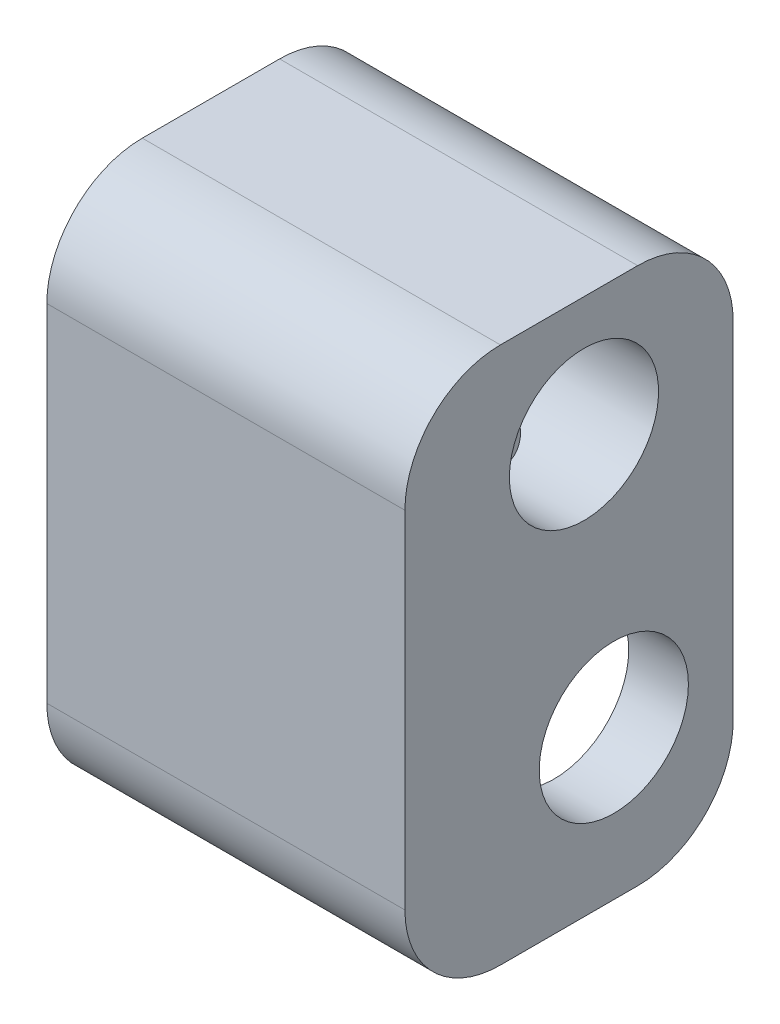
ISO-10303-21;
HEADER;
FILE_DESCRIPTION(('STEP AP214'),'2;1');
FILE_NAME('part.step','',(''),(''),'','','');
FILE_SCHEMA(('AUTOMOTIVE_DESIGN { 1 0 10303 214 1 1 1 1 }'));
ENDSEC;
DATA;
#1=APPLICATION_CONTEXT('core data for automotive mechanical design processes');
#2=APPLICATION_PROTOCOL_DEFINITION('international standard','automotive_design',2000,#1);
#3=PRODUCT_CONTEXT('',#1,'mechanical');
#4=PRODUCT('Part','Part','',(#3));
#5=PRODUCT_RELATED_PRODUCT_CATEGORY('part','',(#4));
#6=PRODUCT_DEFINITION_FORMATION('','',#4);
#7=PRODUCT_DEFINITION_CONTEXT('part definition',#1,'design');
#8=PRODUCT_DEFINITION('design','',#6,#7);
#9=PRODUCT_DEFINITION_SHAPE('','',#8);
#10=(LENGTH_UNIT() NAMED_UNIT(*) SI_UNIT(.MILLI.,.METRE.));
#11=(NAMED_UNIT(*) PLANE_ANGLE_UNIT() SI_UNIT($,.RADIAN.));
#12=(NAMED_UNIT(*) SI_UNIT($,.STERADIAN.) SOLID_ANGLE_UNIT());
#13=UNCERTAINTY_MEASURE_WITH_UNIT(LENGTH_MEASURE(1.E-05),#10,'distance_accuracy_value','');
#14=(GEOMETRIC_REPRESENTATION_CONTEXT(3) GLOBAL_UNCERTAINTY_ASSIGNED_CONTEXT((#13)) GLOBAL_UNIT_ASSIGNED_CONTEXT((#10,
#11,#12)) REPRESENTATION_CONTEXT('',''));
#15=CARTESIAN_POINT('',(0.,0.,0.));
#16=DIRECTION('',(0.,0.,1.));
#17=DIRECTION('',(1.,0.,0.));
#18=AXIS2_PLACEMENT_3D('',#15,#16,#17);
#19=CARTESIAN_POINT('',(6.,0.,0.));
#20=DIRECTION('',(0.,1.,0.));
#21=DIRECTION('',(0.,0.,1.));
#22=AXIS2_PLACEMENT_3D('',#19,#20,#21);
#23=PLANE('',#22);
#24=DIRECTION('',(0.,0.,-1.));
#25=VECTOR('',#24,1.);
#26=CARTESIAN_POINT('',(5.,0.,-1.));
#27=LINE('',#26,#25);
#28=CARTESIAN_POINT('',(5.,0.,-1.6));
#29=VERTEX_POINT('',#28);
#30=CARTESIAN_POINT('',(5.,0.,-3.9));
#31=VERTEX_POINT('',#30);
#32=EDGE_CURVE('E169',#29,#31,#27,.T.);
#33=ORIENTED_EDGE('',*,*,#32,.T.);
#34=DIRECTION('',(-1.,0.,0.));
#35=VECTOR('',#34,1.);
#36=CARTESIAN_POINT('',(6.,0.,-3.9));
#37=LINE('',#36,#35);
#38=CARTESIAN_POINT('',(6.,0.,-3.9));
#39=VERTEX_POINT('',#38);
#40=EDGE_CURVE('E228',#31,#39,#37,.F.);
#41=ORIENTED_EDGE('',*,*,#40,.T.);
#42=DIRECTION('',(0.,0.,-1.));
#43=VECTOR('',#42,1.);
#44=CARTESIAN_POINT('',(6.,0.,0.));
#45=LINE('',#44,#43);
#46=CARTESIAN_POINT('',(6.,0.,-1.6));
#47=VERTEX_POINT('',#46);
#48=EDGE_CURVE('E186',#47,#39,#45,.T.);
#49=ORIENTED_EDGE('',*,*,#48,.F.);
#50=DIRECTION('',(-1.,0.,0.));
#51=VECTOR('',#50,1.);
#52=CARTESIAN_POINT('',(6.,0.,-1.6));
#53=LINE('',#52,#51);
#54=EDGE_CURVE('E223',#47,#29,#53,.T.);
#55=ORIENTED_EDGE('',*,*,#54,.T.);
#56=EDGE_LOOP('',(#33,#41,#49,#55));
#57=FACE_BOUND('',#56,.T.);
#58=ADVANCED_FACE('F35',(#57),#23,.F.);
#59=CARTESIAN_POINT('',(6.,2.5,-3.5));
#60=DIRECTION('',(-1.,0.,0.));
#61=DIRECTION('',(0.,0.,1.));
#62=AXIS2_PLACEMENT_3D('',#59,#60,#61);
#63=CYLINDRICAL_SURFACE('',#62,1.25);
#64=CARTESIAN_POINT('',(5.,2.5,-3.5));
#65=DIRECTION('',(1.,0.,0.));
#66=DIRECTION('',(0.,0.,-1.));
#67=AXIS2_PLACEMENT_3D('',#64,#65,#66);
#68=CIRCLE('',#67,1.25);
#69=CARTESIAN_POINT('',(5.,2.5,-4.75));
#70=VERTEX_POINT('',#69);
#71=EDGE_CURVE('E182',#70,#70,#68,.T.);
#72=ORIENTED_EDGE('',*,*,#71,.F.);
#73=EDGE_LOOP('',(#72));
#74=FACE_BOUND('',#73,.T.);
#75=CARTESIAN_POINT('',(6.,2.5,-3.5));
#76=DIRECTION('',(1.,0.,0.));
#77=DIRECTION('',(0.,0.,-1.));
#78=AXIS2_PLACEMENT_3D('',#75,#76,#77);
#79=CIRCLE('',#78,1.25);
#80=CARTESIAN_POINT('',(6.,2.5,-4.75));
#81=VERTEX_POINT('',#80);
#82=EDGE_CURVE('E175',#81,#81,#79,.T.);
#83=ORIENTED_EDGE('',*,*,#82,.T.);
#84=EDGE_LOOP('',(#83));
#85=FACE_BOUND('',#84,.T.);
#86=ADVANCED_FACE('F315',(#74,#85),#63,.F.);
#87=CARTESIAN_POINT('',(6.,0.,0.));
#88=DIRECTION('',(-1.,0.,0.));
#89=DIRECTION('',(0.,0.,1.));
#90=AXIS2_PLACEMENT_3D('',#87,#88,#89);
#91=PLANE('',#90);
#92=CARTESIAN_POINT('',(6.,7.,-3.));
#93=DIRECTION('',(-1.,0.,0.));
#94=DIRECTION('',(0.,0.,1.));
#95=AXIS2_PLACEMENT_3D('',#92,#93,#94);
#96=CIRCLE('',#95,1.25);
#97=CARTESIAN_POINT('',(6.,7.,-1.75));
#98=VERTEX_POINT('',#97);
#99=EDGE_CURVE('E165',#98,#98,#96,.F.);
#100=ORIENTED_EDGE('',*,*,#99,.F.);
#101=EDGE_LOOP('',(#100));
#102=FACE_BOUND('',#101,.T.);
#103=ORIENTED_EDGE('',*,*,#48,.T.);
#104=CARTESIAN_POINT('',(6.,1.6,-3.9));
#105=DIRECTION('',(-1.,0.,0.));
#106=DIRECTION('',(0.,0.,1.));
#107=AXIS2_PLACEMENT_3D('',#104,#105,#106);
#108=CIRCLE('',#107,1.6);
#109=CARTESIAN_POINT('',(6.,1.6,-5.5));
#110=VERTEX_POINT('',#109);
#111=EDGE_CURVE('E236',#39,#110,#108,.F.);
#112=ORIENTED_EDGE('',*,*,#111,.T.);
#113=DIRECTION('',(0.,1.,0.));
#114=VECTOR('',#113,1.);
#115=CARTESIAN_POINT('',(6.,0.,-5.5));
#116=LINE('',#115,#114);
#117=CARTESIAN_POINT('',(6.,7.4,-5.5));
#118=VERTEX_POINT('',#117);
#119=EDGE_CURVE('E190',#110,#118,#116,.T.);
#120=ORIENTED_EDGE('',*,*,#119,.T.);
#121=CARTESIAN_POINT('',(6.,7.4,-3.9));
#122=DIRECTION('',(-1.,0.,0.));
#123=DIRECTION('',(0.,0.,1.));
#124=AXIS2_PLACEMENT_3D('',#121,#122,#123);
#125=CIRCLE('',#124,1.6);
#126=CARTESIAN_POINT('',(6.,9.,-3.9));
#127=VERTEX_POINT('',#126);
#128=EDGE_CURVE('E234',#118,#127,#125,.F.);
#129=ORIENTED_EDGE('',*,*,#128,.T.);
#130=DIRECTION('',(0.,0.,1.));
#131=VECTOR('',#130,1.);
#132=CARTESIAN_POINT('',(6.,9.,0.));
#133=LINE('',#132,#131);
#134=CARTESIAN_POINT('',(6.,9.,-1.6));
#135=VERTEX_POINT('',#134);
#136=EDGE_CURVE('E193',#127,#135,#133,.T.);
#137=ORIENTED_EDGE('',*,*,#136,.T.);
#138=CARTESIAN_POINT('',(6.,7.4,-1.6));
#139=DIRECTION('',(-1.,0.,0.));
#140=DIRECTION('',(0.,0.,1.));
#141=AXIS2_PLACEMENT_3D('',#138,#139,#140);
#142=CIRCLE('',#141,1.6);
#143=CARTESIAN_POINT('',(6.,7.4,0.));
#144=VERTEX_POINT('',#143);
#145=EDGE_CURVE('E230',#135,#144,#142,.F.);
#146=ORIENTED_EDGE('',*,*,#145,.T.);
#147=DIRECTION('',(0.,-1.,0.));
#148=VECTOR('',#147,1.);
#149=CARTESIAN_POINT('',(6.,0.,0.));
#150=LINE('',#149,#148);
#151=CARTESIAN_POINT('',(6.,1.6,0.));
#152=VERTEX_POINT('',#151);
#153=EDGE_CURVE('E183',#144,#152,#150,.T.);
#154=ORIENTED_EDGE('',*,*,#153,.T.);
#155=CARTESIAN_POINT('',(6.,1.6,-1.6));
#156=DIRECTION('',(-1.,0.,0.));
#157=DIRECTION('',(0.,0.,1.));
#158=AXIS2_PLACEMENT_3D('',#155,#156,#157);
#159=CIRCLE('',#158,1.6);
#160=EDGE_CURVE('E232',#152,#47,#159,.F.);
#161=ORIENTED_EDGE('',*,*,#160,.T.);
#162=EDGE_LOOP('',(#103,#112,#120,#129,#137,#146,#154,#161));
#163=FACE_BOUND('',#162,.T.);
#164=ORIENTED_EDGE('',*,*,#82,.F.);
#165=EDGE_LOOP('',(#164));
#166=FACE_BOUND('',#165,.T.);
#167=ADVANCED_FACE('F273',(#102,#163,#166),#91,.F.);
#168=CARTESIAN_POINT('',(0.,0.,0.));
#169=DIRECTION('',(-1.,0.,0.));
#170=DIRECTION('',(0.,0.,1.));
#171=AXIS2_PLACEMENT_3D('',#168,#169,#170);
#172=PLANE('',#171);
#173=CARTESIAN_POINT('',(0.,7.,-3.));
#174=DIRECTION('',(-1.,0.,0.));
#175=DIRECTION('',(0.,0.,1.));
#176=AXIS2_PLACEMENT_3D('',#173,#174,#175);
#177=CIRCLE('',#176,1.25);
#178=CARTESIAN_POINT('',(0.,7.,-1.75));
#179=VERTEX_POINT('',#178);
#180=EDGE_CURVE('E348',#179,#179,#177,.T.);
#181=ORIENTED_EDGE('',*,*,#180,.F.);
#182=EDGE_LOOP('',(#181));
#183=FACE_BOUND('',#182,.T.);
#184=DIRECTION('',(0.,1.,0.));
#185=VECTOR('',#184,1.);
#186=CARTESIAN_POINT('',(0.,0.,-5.5));
#187=LINE('',#186,#185);
#188=CARTESIAN_POINT('',(0.,1.6,-5.5));
#189=VERTEX_POINT('',#188);
#190=CARTESIAN_POINT('',(0.,7.4,-5.5));
#191=VERTEX_POINT('',#190);
#192=EDGE_CURVE('E202',#189,#191,#187,.T.);
#193=ORIENTED_EDGE('',*,*,#192,.F.);
#194=CARTESIAN_POINT('',(0.,1.6,-3.9));
#195=DIRECTION('',(-1.,0.,0.));
#196=DIRECTION('',(0.,0.,1.));
#197=AXIS2_PLACEMENT_3D('',#194,#195,#196);
#198=CIRCLE('',#197,1.6);
#199=CARTESIAN_POINT('',(0.,0.,-3.9));
#200=VERTEX_POINT('',#199);
#201=EDGE_CURVE('E243',#189,#200,#198,.T.);
#202=ORIENTED_EDGE('',*,*,#201,.T.);
#203=DIRECTION('',(0.,0.,-1.));
#204=VECTOR('',#203,1.);
#205=CARTESIAN_POINT('',(0.,0.,0.));
#206=LINE('',#205,#204);
#207=CARTESIAN_POINT('',(0.,0.,-1.6));
#208=VERTEX_POINT('',#207);
#209=EDGE_CURVE('E199',#208,#200,#206,.T.);
#210=ORIENTED_EDGE('',*,*,#209,.F.);
#211=CARTESIAN_POINT('',(0.,1.6,-1.6));
#212=DIRECTION('',(-1.,0.,0.));
#213=DIRECTION('',(0.,0.,1.));
#214=AXIS2_PLACEMENT_3D('',#211,#212,#213);
#215=CIRCLE('',#214,1.6);
#216=CARTESIAN_POINT('',(0.,1.6,0.));
#217=VERTEX_POINT('',#216);
#218=EDGE_CURVE('E239',#208,#217,#215,.T.);
#219=ORIENTED_EDGE('',*,*,#218,.T.);
#220=DIRECTION('',(0.,-1.,0.));
#221=VECTOR('',#220,1.);
#222=CARTESIAN_POINT('',(0.,0.,0.));
#223=LINE('',#222,#221);
#224=CARTESIAN_POINT('',(0.,7.4,0.));
#225=VERTEX_POINT('',#224);
#226=EDGE_CURVE('E178',#225,#217,#223,.T.);
#227=ORIENTED_EDGE('',*,*,#226,.F.);
#228=CARTESIAN_POINT('',(0.,7.4,-1.6));
#229=DIRECTION('',(-1.,0.,0.));
#230=DIRECTION('',(0.,0.,1.));
#231=AXIS2_PLACEMENT_3D('',#228,#229,#230);
#232=CIRCLE('',#231,1.6);
#233=CARTESIAN_POINT('',(0.,9.,-1.6));
#234=VERTEX_POINT('',#233);
#235=EDGE_CURVE('E58',#225,#234,#232,.T.);
#236=ORIENTED_EDGE('',*,*,#235,.T.);
#237=DIRECTION('',(0.,0.,1.));
#238=VECTOR('',#237,1.);
#239=CARTESIAN_POINT('',(0.,9.,0.));
#240=LINE('',#239,#238);
#241=CARTESIAN_POINT('',(0.,9.,-3.9));
#242=VERTEX_POINT('',#241);
#243=EDGE_CURVE('E187',#242,#234,#240,.T.);
#244=ORIENTED_EDGE('',*,*,#243,.F.);
#245=CARTESIAN_POINT('',(0.,7.4,-3.9));
#246=DIRECTION('',(-1.,0.,0.));
#247=DIRECTION('',(0.,0.,1.));
#248=AXIS2_PLACEMENT_3D('',#245,#246,#247);
#249=CIRCLE('',#248,1.6);
#250=EDGE_CURVE('E241',#242,#191,#249,.T.);
#251=ORIENTED_EDGE('',*,*,#250,.T.);
#252=EDGE_LOOP('',(#193,#202,#210,#219,#227,#236,#244,#251));
#253=FACE_BOUND('',#252,.T.);
#254=CARTESIAN_POINT('',(0.,2.5,-3.5));
#255=DIRECTION('',(1.,0.,0.));
#256=DIRECTION('',(0.,0.,-1.));
#257=AXIS2_PLACEMENT_3D('',#254,#255,#256);
#258=CIRCLE('',#257,1.25);
#259=CARTESIAN_POINT('',(0.,2.5,-4.75));
#260=VERTEX_POINT('',#259);
#261=EDGE_CURVE('E179',#260,#260,#258,.T.);
#262=ORIENTED_EDGE('',*,*,#261,.T.);
#263=EDGE_LOOP('',(#262));
#264=FACE_BOUND('',#263,.T.);
#265=ADVANCED_FACE('F263',(#183,#253,#264),#172,.T.);
#266=CARTESIAN_POINT('',(6.,0.,0.));
#267=DIRECTION('',(0.,0.,-1.));
#268=DIRECTION('',(-1.,0.,0.));
#269=AXIS2_PLACEMENT_3D('',#266,#267,#268);
#270=PLANE('',#269);
#271=ORIENTED_EDGE('',*,*,#226,.T.);
#272=DIRECTION('',(-1.,0.,0.));
#273=VECTOR('',#272,1.);
#274=CARTESIAN_POINT('',(6.,1.6,0.));
#275=LINE('',#274,#273);
#276=EDGE_CURVE('E11',#217,#152,#275,.F.);
#277=ORIENTED_EDGE('',*,*,#276,.T.);
#278=ORIENTED_EDGE('',*,*,#153,.F.);
#279=DIRECTION('',(-1.,0.,0.));
#280=VECTOR('',#279,1.);
#281=CARTESIAN_POINT('',(6.,7.4,0.));
#282=LINE('',#281,#280);
#283=EDGE_CURVE('E43',#144,#225,#282,.T.);
#284=ORIENTED_EDGE('',*,*,#283,.T.);
#285=EDGE_LOOP('',(#271,#277,#278,#284));
#286=FACE_BOUND('',#285,.T.);
#287=ADVANCED_FACE('F258',(#286),#270,.F.);
#288=ORIENTED_EDGE('',*,*,#209,.T.);
#289=DIRECTION('',(-1.,0.,0.));
#290=VECTOR('',#289,1.);
#291=CARTESIAN_POINT('',(6.,0.,-3.9));
#292=LINE('',#291,#290);
#293=CARTESIAN_POINT('',(2.5,0.,-3.9));
#294=VERTEX_POINT('',#293);
#295=EDGE_CURVE('E226',#200,#294,#292,.F.);
#296=ORIENTED_EDGE('',*,*,#295,.T.);
#297=DIRECTION('',(0.,0.,-1.));
#298=VECTOR('',#297,1.);
#299=CARTESIAN_POINT('',(2.5,0.,-1.));
#300=LINE('',#299,#298);
#301=CARTESIAN_POINT('',(2.5,0.,-1.6));
#302=VERTEX_POINT('',#301);
#303=EDGE_CURVE('E155',#302,#294,#300,.T.);
#304=ORIENTED_EDGE('',*,*,#303,.F.);
#305=DIRECTION('',(-1.,0.,0.));
#306=VECTOR('',#305,1.);
#307=CARTESIAN_POINT('',(6.,0.,-1.6));
#308=LINE('',#307,#306);
#309=EDGE_CURVE('E221',#302,#208,#308,.T.);
#310=ORIENTED_EDGE('',*,*,#309,.T.);
#311=EDGE_LOOP('',(#288,#296,#304,#310));
#312=FACE_BOUND('',#311,.T.);
#313=ADVANCED_FACE('F304',(#312),#23,.F.);
#314=CARTESIAN_POINT('',(6.,0.,-5.5));
#315=DIRECTION('',(0.,0.,1.));
#316=DIRECTION('',(1.,0.,0.));
#317=AXIS2_PLACEMENT_3D('',#314,#315,#316);
#318=PLANE('',#317);
#319=ORIENTED_EDGE('',*,*,#119,.F.);
#320=DIRECTION('',(-1.,0.,0.));
#321=VECTOR('',#320,1.);
#322=CARTESIAN_POINT('',(6.,1.6,-5.5));
#323=LINE('',#322,#321);
#324=CARTESIAN_POINT('',(5.,1.6,-5.5));
#325=VERTEX_POINT('',#324);
#326=EDGE_CURVE('E214',#110,#325,#323,.T.);
#327=ORIENTED_EDGE('',*,*,#326,.T.);
#328=DIRECTION('',(0.,-1.,0.));
#329=VECTOR('',#328,1.);
#330=CARTESIAN_POINT('',(5.,0.,-5.5));
#331=LINE('',#330,#329);
#332=CARTESIAN_POINT('',(5.,4.8,-5.5));
#333=VERTEX_POINT('',#332);
#334=EDGE_CURVE('E143',#333,#325,#331,.T.);
#335=ORIENTED_EDGE('',*,*,#334,.F.);
#336=CARTESIAN_POINT('',(3.75,4.8,-5.5));
#337=DIRECTION('',(0.,0.,-1.));
#338=DIRECTION('',(-1.,0.,0.));
#339=AXIS2_PLACEMENT_3D('',#336,#337,#338);
#340=CIRCLE('',#339,1.25);
#341=CARTESIAN_POINT('',(2.5,4.8,-5.5));
#342=VERTEX_POINT('',#341);
#343=EDGE_CURVE('E164',#342,#333,#340,.T.);
#344=ORIENTED_EDGE('',*,*,#343,.F.);
#345=DIRECTION('',(0.,1.,0.));
#346=VECTOR('',#345,1.);
#347=CARTESIAN_POINT('',(2.5,0.,-5.5));
#348=LINE('',#347,#346);
#349=CARTESIAN_POINT('',(2.5,1.6,-5.5));
#350=VERTEX_POINT('',#349);
#351=EDGE_CURVE('E150',#350,#342,#348,.T.);
#352=ORIENTED_EDGE('',*,*,#351,.F.);
#353=DIRECTION('',(-1.,0.,0.));
#354=VECTOR('',#353,1.);
#355=CARTESIAN_POINT('',(6.,1.6,-5.5));
#356=LINE('',#355,#354);
#357=EDGE_CURVE('E211',#350,#189,#356,.T.);
#358=ORIENTED_EDGE('',*,*,#357,.T.);
#359=ORIENTED_EDGE('',*,*,#192,.T.);
#360=DIRECTION('',(-1.,0.,0.));
#361=VECTOR('',#360,1.);
#362=CARTESIAN_POINT('',(6.,7.4,-5.5));
#363=LINE('',#362,#361);
#364=EDGE_CURVE('E196',#191,#118,#363,.F.);
#365=ORIENTED_EDGE('',*,*,#364,.T.);
#366=EDGE_LOOP('',(#319,#327,#335,#344,#352,#358,#359,#365));
#367=FACE_BOUND('',#366,.T.);
#368=ADVANCED_FACE('F285',(#367),#318,.F.);
#369=CARTESIAN_POINT('',(6.,9.,0.));
#370=DIRECTION('',(0.,-1.,0.));
#371=DIRECTION('',(0.,0.,-1.));
#372=AXIS2_PLACEMENT_3D('',#369,#370,#371);
#373=PLANE('',#372);
#374=ORIENTED_EDGE('',*,*,#136,.F.);
#375=DIRECTION('',(-1.,0.,0.));
#376=VECTOR('',#375,1.);
#377=CARTESIAN_POINT('',(6.,9.,-3.9));
#378=LINE('',#377,#376);
#379=EDGE_CURVE('E251',#127,#242,#378,.T.);
#380=ORIENTED_EDGE('',*,*,#379,.T.);
#381=ORIENTED_EDGE('',*,*,#243,.T.);
#382=DIRECTION('',(-1.,0.,0.));
#383=VECTOR('',#382,1.);
#384=CARTESIAN_POINT('',(6.,9.,-1.6));
#385=LINE('',#384,#383);
#386=EDGE_CURVE('E249',#234,#135,#385,.F.);
#387=ORIENTED_EDGE('',*,*,#386,.T.);
#388=EDGE_LOOP('',(#374,#380,#381,#387));
#389=FACE_BOUND('',#388,.T.);
#390=ADVANCED_FACE('F279',(#389),#373,.F.);
#391=CARTESIAN_POINT('',(2.5,2.5,-3.5));
#392=DIRECTION('',(-1.,0.,0.));
#393=DIRECTION('',(0.,0.,1.));
#394=AXIS2_PLACEMENT_3D('',#391,#392,#393);
#395=CIRCLE('',#394,1.25);
#396=CARTESIAN_POINT('',(2.5,2.5,-2.25));
#397=VERTEX_POINT('',#396);
#398=EDGE_CURVE('E172',#397,#397,#395,.T.);
#399=ORIENTED_EDGE('',*,*,#398,.F.);
#400=EDGE_LOOP('',(#399));
#401=FACE_BOUND('',#400,.T.);
#402=ORIENTED_EDGE('',*,*,#261,.F.);
#403=EDGE_LOOP('',(#402));
#404=FACE_BOUND('',#403,.T.);
#405=ADVANCED_FACE('F321',(#401,#404),#63,.F.);
#406=CARTESIAN_POINT('',(3.75,0.,-1.));
#407=DIRECTION('',(0.,0.,-1.));
#408=DIRECTION('',(-1.,0.,0.));
#409=AXIS2_PLACEMENT_3D('',#406,#407,#408);
#410=PLANE('',#409);
#411=DIRECTION('',(0.,-1.,0.));
#412=VECTOR('',#411,1.);
#413=CARTESIAN_POINT('',(5.,0.,-1.));
#414=LINE('',#413,#412);
#415=CARTESIAN_POINT('',(5.,4.8,-1.));
#416=VERTEX_POINT('',#415);
#417=CARTESIAN_POINT('',(5.,0.116760302580868,-1.));
#418=VERTEX_POINT('',#417);
#419=EDGE_CURVE('E158',#416,#418,#414,.T.);
#420=ORIENTED_EDGE('',*,*,#419,.T.);
#421=DIRECTION('',(-1.,0.,0.));
#422=VECTOR('',#421,1.);
#423=CARTESIAN_POINT('',(5.,0.116760302580868,-1.));
#424=LINE('',#423,#422);
#425=CARTESIAN_POINT('',(2.5,0.116760302580868,-1.));
#426=VERTEX_POINT('',#425);
#427=EDGE_CURVE('E50',#418,#426,#424,.T.);
#428=ORIENTED_EDGE('',*,*,#427,.T.);
#429=DIRECTION('',(0.,1.,0.));
#430=VECTOR('',#429,1.);
#431=CARTESIAN_POINT('',(2.5,0.,-1.));
#432=LINE('',#431,#430);
#433=CARTESIAN_POINT('',(2.5,4.8,-1.));
#434=VERTEX_POINT('',#433);
#435=EDGE_CURVE('E135',#426,#434,#432,.T.);
#436=ORIENTED_EDGE('',*,*,#435,.T.);
#437=CARTESIAN_POINT('',(3.75,4.8,-1.));
#438=DIRECTION('',(0.,0.,-1.));
#439=DIRECTION('',(-1.,0.,0.));
#440=AXIS2_PLACEMENT_3D('',#437,#438,#439);
#441=CIRCLE('',#440,1.25);
#442=EDGE_CURVE('E139',#434,#416,#441,.T.);
#443=ORIENTED_EDGE('',*,*,#442,.T.);
#444=EDGE_LOOP('',(#420,#428,#436,#443));
#445=FACE_BOUND('',#444,.T.);
#446=ADVANCED_FACE('F137',(#445),#410,.T.);
#447=CARTESIAN_POINT('',(5.,0.,-1.));
#448=DIRECTION('',(1.,0.,0.));
#449=DIRECTION('',(0.,0.,-1.));
#450=AXIS2_PLACEMENT_3D('',#447,#448,#449);
#451=PLANE('',#450);
#452=ORIENTED_EDGE('',*,*,#71,.T.);
#453=EDGE_LOOP('',(#452));
#454=FACE_BOUND('',#453,.T.);
#455=ORIENTED_EDGE('',*,*,#334,.T.);
#456=CARTESIAN_POINT('',(5.,1.6,-3.9));
#457=DIRECTION('',(1.,0.,0.));
#458=DIRECTION('',(0.,0.,-1.));
#459=AXIS2_PLACEMENT_3D('',#456,#457,#458);
#460=CIRCLE('',#459,1.6);
#461=EDGE_CURVE('E219',#325,#31,#460,.F.);
#462=ORIENTED_EDGE('',*,*,#461,.T.);
#463=ORIENTED_EDGE('',*,*,#32,.F.);
#464=CARTESIAN_POINT('',(5.,1.6,-1.6));
#465=DIRECTION('',(1.,0.,0.));
#466=DIRECTION('',(0.,0.,-1.));
#467=AXIS2_PLACEMENT_3D('',#464,#465,#466);
#468=CIRCLE('',#467,1.6);
#469=EDGE_CURVE('E217',#29,#418,#468,.F.);
#470=ORIENTED_EDGE('',*,*,#469,.T.);
#471=ORIENTED_EDGE('',*,*,#419,.F.);
#472=DIRECTION('',(0.,0.,-1.));
#473=VECTOR('',#472,1.);
#474=CARTESIAN_POINT('',(5.,4.8,-1.));
#475=LINE('',#474,#473);
#476=EDGE_CURVE('E154',#416,#333,#475,.T.);
#477=ORIENTED_EDGE('',*,*,#476,.T.);
#478=EDGE_LOOP('',(#455,#462,#463,#470,#471,#477));
#479=FACE_BOUND('',#478,.T.);
#480=ADVANCED_FACE('F297',(#454,#479),#451,.F.);
#481=CARTESIAN_POINT('',(3.75,4.8,-1.));
#482=DIRECTION('',(0.,0.,-1.));
#483=DIRECTION('',(-1.,0.,0.));
#484=AXIS2_PLACEMENT_3D('',#481,#482,#483);
#485=CYLINDRICAL_SURFACE('',#484,1.25);
#486=CARTESIAN_POINT('',(4.5624038404636,5.75,-3.));
#487=CARTESIAN_POINT('',(4.56240418870236,5.75000236516246,-2.95581933879932));
#488=CARTESIAN_POINT('',(4.55966912303325,5.75235993764812,-2.91159145701231));
#489=CARTESIAN_POINT('',(4.54863066106889,5.76163374172517,-2.824263526194));
#490=CARTESIAN_POINT('',(4.54031742349955,5.76855802976168,-2.78116561057822));
#491=CARTESIAN_POINT('',(4.51787910812302,5.78644160394433,-2.69732388496532));
#492=CARTESIAN_POINT('',(4.50374857730432,5.79740467494639,-2.65658232474391));
#493=CARTESIAN_POINT('',(4.46946801975538,5.82240543177396,-2.5787634576274));
#494=CARTESIAN_POINT('',(4.44932255221657,5.83644078673226,-2.54168340361756));
#495=CARTESIAN_POINT('',(4.40343544607797,5.86594980199701,-2.47292762771545));
#496=CARTESIAN_POINT('',(4.37780563848766,5.88139161531635,-2.44116372408119));
#497=CARTESIAN_POINT('',(4.32109260976867,5.91238207189968,-2.38301083970007));
#498=CARTESIAN_POINT('',(4.29000969334678,5.92793070914799,-2.35662155880997));
#499=CARTESIAN_POINT('',(4.22420591105934,5.95710060461464,-2.31037130771588));
#500=CARTESIAN_POINT('',(4.18963124999131,5.97076727671397,-2.29033021427901));
#501=CARTESIAN_POINT('',(4.11700579091417,5.99552448137109,-2.25569908673368));
#502=CARTESIAN_POINT('',(4.07895430859226,6.00661450526106,-2.2411101286107));
#503=CARTESIAN_POINT('',(3.99945851201921,6.02555316617313,-2.21693133051049));
#504=CARTESIAN_POINT('',(3.95795389741558,6.03331569187216,-2.20747278718078));
#505=CARTESIAN_POINT('',(3.87351769327328,6.04461218954887,-2.19389067774363));
#506=CARTESIAN_POINT('',(3.83058569712398,6.04814494582146,-2.18976864540929));
#507=CARTESIAN_POINT('',(3.74246155360126,6.0507883771461,-2.18667181030199));
#508=CARTESIAN_POINT('',(3.69725453629062,6.04969320201445,-2.18793663386317));
#509=CARTESIAN_POINT('',(3.60774036323148,6.04268979641826,-2.1962052735691));
#510=CARTESIAN_POINT('',(3.56343329861488,6.03678108098622,-2.20320966798));
#511=CARTESIAN_POINT('',(3.47662083481959,6.02054468528009,-2.22325392520599));
#512=CARTESIAN_POINT('',(3.4341342679791,6.01017933612963,-2.23634531582942));
#513=CARTESIAN_POINT('',(3.35272315130917,5.98594830247847,-2.26883176435737));
#514=CARTESIAN_POINT('',(3.31379706333421,5.97208413930738,-2.28822408358751));
#515=CARTESIAN_POINT('',(3.2421430297815,5.94281390985303,-2.33251843603541));
#516=CARTESIAN_POINT('',(3.20923488891256,5.92748716018822,-2.35718120357569));
#517=CARTESIAN_POINT('',(3.14873397528337,5.89642041067868,-2.41211910044094));
#518=CARTESIAN_POINT('',(3.12113994524567,5.88068050958623,-2.44239289890496));
#519=CARTESIAN_POINT('',(3.07265124301884,5.85094313839732,-2.50666917836498));
#520=CARTESIAN_POINT('',(3.05155013508387,5.83690320832832,-2.54049690916282));
#521=CARTESIAN_POINT('',(3.01482043100891,5.81119509375858,-2.6118248478338));
#522=CARTESIAN_POINT('',(2.99919292856081,5.79952738345089,-2.64932578774472));
#523=CARTESIAN_POINT('',(2.97302510425285,5.77933148648929,-2.72771656224768));
#524=CARTESIAN_POINT('',(2.9625896390551,5.77086877691167,-2.76865812382894));
#525=CARTESIAN_POINT('',(2.94704586866992,5.75805340456327,-2.85216590682384));
#526=CARTESIAN_POINT('',(2.94193907240648,5.75370190600077,-2.89473258488799));
#527=CARTESIAN_POINT('',(2.9367939884166,5.74932033190167,-2.98236161884342));
#528=CARTESIAN_POINT('',(2.93699901391236,5.74949770041759,-3.02744886947592));
#529=CARTESIAN_POINT('',(2.94308764629392,5.75467686393807,-3.11696510122973));
#530=CARTESIAN_POINT('',(2.94897205457991,5.75967933979859,-3.16139398855306));
#531=CARTESIAN_POINT('',(2.96672180794323,5.77422191869835,-3.24891968178456));
#532=CARTESIAN_POINT('',(2.97866620871351,5.78382190330528,-3.29199067412332));
#533=CARTESIAN_POINT('',(3.00883599420867,5.806743449594,-3.37481115723541));
#534=CARTESIAN_POINT('',(3.02705887705977,5.82006352847844,-3.41456196322221));
#535=CARTESIAN_POINT('',(3.06915834609485,5.84860632887292,-3.48815704135755));
#536=CARTESIAN_POINT('',(3.09281441177293,5.86374601073413,-3.52215949065378));
#537=CARTESIAN_POINT('',(3.14587912744912,5.89475022839999,-3.58493620928654));
#538=CARTESIAN_POINT('',(3.1752861036358,5.91061455226923,-3.61371199516251));
#539=CARTESIAN_POINT('',(3.2379558110524,5.94082031233271,-3.66443861170597));
#540=CARTESIAN_POINT('',(3.27102016079087,5.95519715885422,-3.68661427570275));
#541=CARTESIAN_POINT('',(3.34101751566352,5.98179298073589,-3.72547294761361));
#542=CARTESIAN_POINT('',(3.37795121441616,5.99401156814904,-3.74215496851038));
#543=CARTESIAN_POINT('',(3.45519888363091,6.01540983986253,-3.77032543814249));
#544=CARTESIAN_POINT('',(3.49555312232771,6.02454431992448,-3.78173746395489));
#545=CARTESIAN_POINT('',(3.57808185349689,6.03882996488495,-3.79923718479557));
#546=CARTESIAN_POINT('',(3.62025685225501,6.04398001423061,-3.80532338877349));
#547=CARTESIAN_POINT('',(3.70730786599538,6.05006687373362,-3.81249702391142));
#548=CARTESIAN_POINT('',(3.75221859136072,6.05079781835713,-3.81334025854201));
#549=CARTESIAN_POINT('',(3.84161871563015,6.04744047292913,-3.80940507058911));
#550=CARTESIAN_POINT('',(3.88610803964724,6.04335134192121,-3.80462566702678));
#551=CARTESIAN_POINT('',(3.97421462746964,6.03054601921584,-3.78915244000987));
#552=CARTESIAN_POINT('',(4.01780176237118,6.02174783401617,-3.77835366541808));
#553=CARTESIAN_POINT('',(4.10190224977199,6.00022799951336,-3.75050878870306));
#554=CARTESIAN_POINT('',(4.14241664259962,5.98750768556783,-3.73346481249695));
#555=CARTESIAN_POINT('',(4.21787003662466,5.95981171490195,-3.69359620882278));
#556=CARTESIAN_POINT('',(4.2529440713855,5.94491932887609,-3.6709696993046));
#557=CARTESIAN_POINT('',(4.31796517120797,5.91409669423461,-3.61983919993125));
#558=CARTESIAN_POINT('',(4.34791441221035,5.89816689008352,-3.59133771592584));
#559=CARTESIAN_POINT('',(4.40088406532773,5.8675902018416,-3.53034002252948));
#560=CARTESIAN_POINT('',(4.42414431631576,5.85291755833636,-3.49806427947056));
#561=CARTESIAN_POINT('',(4.46516591263227,5.82549941060469,-3.42943355313101));
#562=CARTESIAN_POINT('',(4.48292414766854,5.81275499848348,-3.39307627832049));
#563=CARTESIAN_POINT('',(4.51313029561492,5.7901981115936,-3.31697045337828));
#564=CARTESIAN_POINT('',(4.5255281851363,5.78041350137731,-3.27719394255492));
#565=CARTESIAN_POINT('',(4.54497422975712,5.76471430105713,-3.19567232142571));
#566=CARTESIAN_POINT('',(4.55203027277216,5.75879400658838,-3.15393021077813));
#567=CARTESIAN_POINT('',(4.55848045677873,5.75334369545951,-3.09325199942255));
#568=CARTESIAN_POINT('',(4.55995226495561,5.75209194913403,-3.07465647791803));
#569=CARTESIAN_POINT('',(4.56191388084482,5.75041960299325,-3.03737678831089));
#570=CARTESIAN_POINT('',(4.56240369312549,5.74999899931138,-3.01869262062107));
#571=CARTESIAN_POINT('',(4.5624038404636,5.75,-3.));
#572=B_SPLINE_CURVE_WITH_KNOTS('',3,(#486,#487,#488,#489,#490,#491,#492,#493,#494,#495,#496,
#497,#498,#499,#500,#501,#502,#503,#504,#505,#506,#507,#508,#509,#510,#511,#512,#513,#514,#515,
#516,#517,#518,#519,#520,#521,#522,#523,#524,#525,#526,#527,#528,#529,#530,#531,#532,#533,#534,
#535,#536,#537,#538,#539,#540,#541,#542,#543,#544,#545,#546,#547,#548,#549,#550,#551,#552,#553,
#554,#555,#556,#557,#558,#559,#560,#561,#562,#563,#564,#565,#566,#567,#568,#569,#570,#571),
.UNSPECIFIED.,.T.,.F.,(4,2,2,2,2,2,2,2,2,2,2,2,2,2,2,2,2,2,2,2,2,2,2,2,2,2,2,2,2,2,2,2,2,2,2,2,
2,2,2,2,2,2,4),(0.,0.132476045665611,0.265186428496366,0.398021495602125,0.530756131120126,
0.661005745559933,0.791248084276698,0.917369943634447,1.04351668016552,1.17275536348978,
1.30203118322078,1.43711630606215,1.5722150405063,1.708478840609,1.84468349322592,
1.9756754561007,2.10663638911495,2.23285432689986,2.35909747017152,2.48779602210674,
2.61653100784495,2.75117282843863,2.88583365070256,3.02229818208408,3.1587083973251,
3.29033799844366,3.42192934542739,3.54831864079299,3.67473063156252,3.8029222861177,
3.93114981853791,4.0653075173414,4.19948862604219,4.3360859318551,4.47263678197346,
4.60490390560863,4.73711472972365,4.86372288460509,4.99040248109708,5.1182400084283,
5.24588839721414,5.30193862181144,5.35798858565779),.UNSPECIFIED.);
#573=CARTESIAN_POINT('',(4.5624038404636,5.75,-3.));
#574=VERTEX_POINT('',#573);
#575=EDGE_CURVE('E350',#574,#574,#572,.T.);
#576=ORIENTED_EDGE('',*,*,#575,.F.);
#577=EDGE_LOOP('',(#576));
#578=FACE_BOUND('',#577,.T.);
#579=ORIENTED_EDGE('',*,*,#343,.T.);
#580=ORIENTED_EDGE('',*,*,#476,.F.);
#581=ORIENTED_EDGE('',*,*,#442,.F.);
#582=DIRECTION('',(0.,0.,-1.));
#583=VECTOR('',#582,1.);
#584=CARTESIAN_POINT('',(2.5,4.8,-1.));
#585=LINE('',#584,#583);
#586=EDGE_CURVE('E146',#434,#342,#585,.T.);
#587=ORIENTED_EDGE('',*,*,#586,.T.);
#588=EDGE_LOOP('',(#579,#580,#581,#587));
#589=FACE_BOUND('',#588,.T.);
#590=ADVANCED_FACE('F157',(#578,#589),#485,.F.);
#591=CARTESIAN_POINT('',(2.5,0.,-1.));
#592=DIRECTION('',(-1.,0.,0.));
#593=DIRECTION('',(0.,0.,1.));
#594=AXIS2_PLACEMENT_3D('',#591,#592,#593);
#595=PLANE('',#594);
#596=ORIENTED_EDGE('',*,*,#398,.T.);
#597=EDGE_LOOP('',(#596));
#598=FACE_BOUND('',#597,.T.);
#599=ORIENTED_EDGE('',*,*,#303,.T.);
#600=CARTESIAN_POINT('',(2.5,1.6,-3.9));
#601=DIRECTION('',(-1.,0.,0.));
#602=DIRECTION('',(0.,0.,1.));
#603=AXIS2_PLACEMENT_3D('',#600,#601,#602);
#604=CIRCLE('',#603,1.6);
#605=EDGE_CURVE('E247',#294,#350,#604,.F.);
#606=ORIENTED_EDGE('',*,*,#605,.T.);
#607=ORIENTED_EDGE('',*,*,#351,.T.);
#608=ORIENTED_EDGE('',*,*,#586,.F.);
#609=ORIENTED_EDGE('',*,*,#435,.F.);
#610=CARTESIAN_POINT('',(2.5,1.6,-1.6));
#611=DIRECTION('',(-1.,0.,0.));
#612=DIRECTION('',(0.,0.,1.));
#613=AXIS2_PLACEMENT_3D('',#610,#611,#612);
#614=CIRCLE('',#613,1.6);
#615=EDGE_CURVE('E245',#426,#302,#614,.F.);
#616=ORIENTED_EDGE('',*,*,#615,.T.);
#617=EDGE_LOOP('',(#599,#606,#607,#608,#609,#616));
#618=FACE_BOUND('',#617,.T.);
#619=ADVANCED_FACE('F148',(#598,#618),#595,.F.);
#620=CARTESIAN_POINT('',(6.001,7.,-3.));
#621=DIRECTION('',(-1.,0.,0.));
#622=DIRECTION('',(0.,0.,1.));
#623=AXIS2_PLACEMENT_3D('',#620,#621,#622);
#624=CYLINDRICAL_SURFACE('',#623,1.25);
#625=ORIENTED_EDGE('',*,*,#575,.T.);
#626=EDGE_LOOP('',(#625));
#627=FACE_BOUND('',#626,.T.);
#628=ORIENTED_EDGE('',*,*,#180,.T.);
#629=EDGE_LOOP('',(#628));
#630=FACE_BOUND('',#629,.T.);
#631=ORIENTED_EDGE('',*,*,#99,.T.);
#632=EDGE_LOOP('',(#631));
#633=FACE_BOUND('',#632,.T.);
#634=ADVANCED_FACE('F358',(#627,#630,#633),#624,.F.);
#635=CARTESIAN_POINT('',(6.,1.6,-3.9));
#636=DIRECTION('',(-1.,0.,0.));
#637=DIRECTION('',(0.,0.,1.));
#638=AXIS2_PLACEMENT_3D('',#635,#636,#637);
#639=CYLINDRICAL_SURFACE('',#638,1.6);
#640=ORIENTED_EDGE('',*,*,#111,.F.);
#641=ORIENTED_EDGE('',*,*,#40,.F.);
#642=ORIENTED_EDGE('',*,*,#461,.F.);
#643=ORIENTED_EDGE('',*,*,#326,.F.);
#644=EDGE_LOOP('',(#640,#641,#642,#643));
#645=FACE_BOUND('',#644,.T.);
#646=ADVANCED_FACE('F293',(#645),#639,.T.);
#647=CARTESIAN_POINT('',(6.,1.6,-3.9));
#648=DIRECTION('',(-1.,0.,0.));
#649=DIRECTION('',(0.,0.,1.));
#650=AXIS2_PLACEMENT_3D('',#647,#648,#649);
#651=CYLINDRICAL_SURFACE('',#650,1.6);
#652=ORIENTED_EDGE('',*,*,#605,.F.);
#653=ORIENTED_EDGE('',*,*,#295,.F.);
#654=ORIENTED_EDGE('',*,*,#201,.F.);
#655=ORIENTED_EDGE('',*,*,#357,.F.);
#656=EDGE_LOOP('',(#652,#653,#654,#655));
#657=FACE_BOUND('',#656,.T.);
#658=ADVANCED_FACE('F301',(#657),#651,.T.);
#659=CARTESIAN_POINT('',(6.,7.4,-3.9));
#660=DIRECTION('',(-1.,0.,0.));
#661=DIRECTION('',(0.,0.,1.));
#662=AXIS2_PLACEMENT_3D('',#659,#660,#661);
#663=CYLINDRICAL_SURFACE('',#662,1.6);
#664=ORIENTED_EDGE('',*,*,#128,.F.);
#665=ORIENTED_EDGE('',*,*,#364,.F.);
#666=ORIENTED_EDGE('',*,*,#250,.F.);
#667=ORIENTED_EDGE('',*,*,#379,.F.);
#668=EDGE_LOOP('',(#664,#665,#666,#667));
#669=FACE_BOUND('',#668,.T.);
#670=ADVANCED_FACE('F288',(#669),#663,.T.);
#671=CARTESIAN_POINT('',(6.,1.6,-1.6));
#672=DIRECTION('',(-1.,0.,0.));
#673=DIRECTION('',(0.,0.,1.));
#674=AXIS2_PLACEMENT_3D('',#671,#672,#673);
#675=CYLINDRICAL_SURFACE('',#674,1.6);
#676=ORIENTED_EDGE('',*,*,#160,.F.);
#677=ORIENTED_EDGE('',*,*,#276,.F.);
#678=ORIENTED_EDGE('',*,*,#218,.F.);
#679=ORIENTED_EDGE('',*,*,#309,.F.);
#680=ORIENTED_EDGE('',*,*,#615,.F.);
#681=ORIENTED_EDGE('',*,*,#427,.F.);
#682=ORIENTED_EDGE('',*,*,#469,.F.);
#683=ORIENTED_EDGE('',*,*,#54,.F.);
#684=EDGE_LOOP('',(#676,#677,#678,#679,#680,#681,#682,#683));
#685=FACE_BOUND('',#684,.T.);
#686=ADVANCED_FACE('F270',(#685),#675,.T.);
#687=CARTESIAN_POINT('',(6.,7.4,-1.6));
#688=DIRECTION('',(-1.,0.,0.));
#689=DIRECTION('',(0.,0.,1.));
#690=AXIS2_PLACEMENT_3D('',#687,#688,#689);
#691=CYLINDRICAL_SURFACE('',#690,1.6);
#692=ORIENTED_EDGE('',*,*,#145,.F.);
#693=ORIENTED_EDGE('',*,*,#386,.F.);
#694=ORIENTED_EDGE('',*,*,#235,.F.);
#695=ORIENTED_EDGE('',*,*,#283,.F.);
#696=EDGE_LOOP('',(#692,#693,#694,#695));
#697=FACE_BOUND('',#696,.T.);
#698=ADVANCED_FACE('F37',(#697),#691,.T.);
#699=CLOSED_SHELL('',(#58,#86,#167,#265,#287,#313,#368,#390,#405,#446,#480,#590,#619,#634,#646,
#658,#670,#686,#698));
#700=MANIFOLD_SOLID_BREP('B2',#699);
#701=ADVANCED_BREP_SHAPE_REPRESENTATION('',(#18,#700),#14);
#702=SHAPE_DEFINITION_REPRESENTATION(#9,#701);
ENDSEC;
END-ISO-10303-21;
